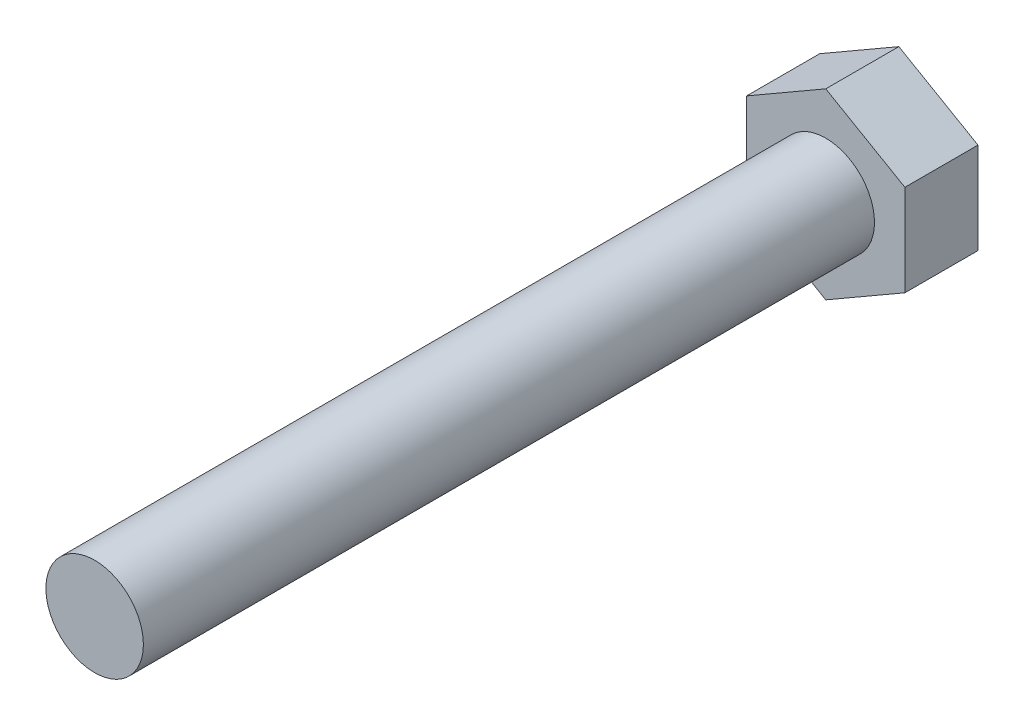
ISO-10303-21;
HEADER;
FILE_DESCRIPTION(('STEP AP214'),'2;1');
FILE_NAME('part.step','',(''),(''),'','','');
FILE_SCHEMA(('AUTOMOTIVE_DESIGN { 1 0 10303 214 1 1 1 1 }'));
ENDSEC;
DATA;
#1=APPLICATION_CONTEXT('core data for automotive mechanical design processes');
#2=APPLICATION_PROTOCOL_DEFINITION('international standard','automotive_design',2000,#1);
#3=PRODUCT_CONTEXT('',#1,'mechanical');
#4=PRODUCT('Part','Part','',(#3));
#5=PRODUCT_RELATED_PRODUCT_CATEGORY('part','',(#4));
#6=PRODUCT_DEFINITION_FORMATION('','',#4);
#7=PRODUCT_DEFINITION_CONTEXT('part definition',#1,'design');
#8=PRODUCT_DEFINITION('design','',#6,#7);
#9=PRODUCT_DEFINITION_SHAPE('','',#8);
#10=(LENGTH_UNIT() NAMED_UNIT(*) SI_UNIT(.MILLI.,.METRE.));
#11=(NAMED_UNIT(*) PLANE_ANGLE_UNIT() SI_UNIT($,.RADIAN.));
#12=(NAMED_UNIT(*) SI_UNIT($,.STERADIAN.) SOLID_ANGLE_UNIT());
#13=UNCERTAINTY_MEASURE_WITH_UNIT(LENGTH_MEASURE(1.E-05),#10,'distance_accuracy_value','');
#14=(GEOMETRIC_REPRESENTATION_CONTEXT(3) GLOBAL_UNCERTAINTY_ASSIGNED_CONTEXT((#13)) GLOBAL_UNIT_ASSIGNED_CONTEXT((#10,
#11,#12)) REPRESENTATION_CONTEXT('',''));
#15=CARTESIAN_POINT('',(0.,0.,0.));
#16=DIRECTION('',(0.,0.,1.));
#17=DIRECTION('',(1.,0.,0.));
#18=AXIS2_PLACEMENT_3D('',#15,#16,#17);
#19=CARTESIAN_POINT('',(6.49519052838323,3.75000000000007,6.));
#20=DIRECTION('',(-0.499999999999995,-0.866025403784441,0.));
#21=DIRECTION('',(0.866025403784442,-0.499999999999995,0.));
#22=AXIS2_PLACEMENT_3D('',#19,#20,#21);
#23=PLANE('',#22);
#24=DIRECTION('',(-0.866025403784442,0.499999999999995,0.));
#25=VECTOR('',#24,1.);
#26=CARTESIAN_POINT('',(6.49519052838323,3.75000000000007,0.));
#27=LINE('',#26,#25);
#28=CARTESIAN_POINT('',(6.49519052838323,3.75000000000007,0.));
#29=VERTEX_POINT('',#28);
#30=CARTESIAN_POINT('',(0.,7.49999999999998,0.));
#31=VERTEX_POINT('',#30);
#32=EDGE_CURVE('E128',#29,#31,#27,.T.);
#33=ORIENTED_EDGE('',*,*,#32,.T.);
#34=DIRECTION('',(0.,0.,-1.));
#35=VECTOR('',#34,1.);
#36=CARTESIAN_POINT('',(0.,7.49999999999998,6.));
#37=LINE('',#36,#35);
#38=CARTESIAN_POINT('',(0.,7.49999999999998,6.));
#39=VERTEX_POINT('',#38);
#40=EDGE_CURVE('E40',#39,#31,#37,.T.);
#41=ORIENTED_EDGE('',*,*,#40,.F.);
#42=DIRECTION('',(-0.866025403784442,0.499999999999995,0.));
#43=VECTOR('',#42,1.);
#44=CARTESIAN_POINT('',(6.49519052838323,3.75000000000007,6.));
#45=LINE('',#44,#43);
#46=CARTESIAN_POINT('',(6.49519052838323,3.75000000000007,6.));
#47=VERTEX_POINT('',#46);
#48=EDGE_CURVE('E145',#47,#39,#45,.T.);
#49=ORIENTED_EDGE('',*,*,#48,.F.);
#50=DIRECTION('',(0.,0.,-1.));
#51=VECTOR('',#50,1.);
#52=CARTESIAN_POINT('',(6.49519052838323,3.75000000000007,6.));
#53=LINE('',#52,#51);
#54=EDGE_CURVE('E124',#47,#29,#53,.T.);
#55=ORIENTED_EDGE('',*,*,#54,.T.);
#56=EDGE_LOOP('',(#33,#41,#49,#55));
#57=FACE_BOUND('',#56,.T.);
#58=ADVANCED_FACE('F37',(#57),#23,.F.);
#59=CARTESIAN_POINT('',(0.,7.49999999999998,6.));
#60=DIRECTION('',(0.500000000000001,-0.866025403784438,0.));
#61=DIRECTION('',(0.866025403784438,0.500000000000001,0.));
#62=AXIS2_PLACEMENT_3D('',#59,#60,#61);
#63=PLANE('',#62);
#64=DIRECTION('',(-0.866025403784438,-0.500000000000001,0.));
#65=VECTOR('',#64,1.);
#66=CARTESIAN_POINT('',(0.,7.49999999999998,0.));
#67=LINE('',#66,#65);
#68=CARTESIAN_POINT('',(-6.49519052838328,3.74999999999998,0.));
#69=VERTEX_POINT('',#68);
#70=EDGE_CURVE('E132',#31,#69,#67,.T.);
#71=ORIENTED_EDGE('',*,*,#70,.T.);
#72=DIRECTION('',(0.,0.,-1.));
#73=VECTOR('',#72,1.);
#74=CARTESIAN_POINT('',(-6.49519052838328,3.74999999999998,6.));
#75=LINE('',#74,#73);
#76=CARTESIAN_POINT('',(-6.49519052838328,3.74999999999998,6.));
#77=VERTEX_POINT('',#76);
#78=EDGE_CURVE('E151',#77,#69,#75,.T.);
#79=ORIENTED_EDGE('',*,*,#78,.F.);
#80=DIRECTION('',(-0.866025403784438,-0.500000000000001,0.));
#81=VECTOR('',#80,1.);
#82=CARTESIAN_POINT('',(0.,7.49999999999998,6.));
#83=LINE('',#82,#81);
#84=EDGE_CURVE('E93',#39,#77,#83,.T.);
#85=ORIENTED_EDGE('',*,*,#84,.F.);
#86=ORIENTED_EDGE('',*,*,#40,.T.);
#87=EDGE_LOOP('',(#71,#79,#85,#86));
#88=FACE_BOUND('',#87,.T.);
#89=ADVANCED_FACE('F158',(#88),#63,.F.);
#90=CARTESIAN_POINT('',(-6.49519052838328,3.74999999999998,6.));
#91=DIRECTION('',(1.,0.,0.));
#92=DIRECTION('',(0.,1.,0.));
#93=AXIS2_PLACEMENT_3D('',#90,#91,#92);
#94=PLANE('',#93);
#95=DIRECTION('',(0.,-1.,0.));
#96=VECTOR('',#95,1.);
#97=CARTESIAN_POINT('',(-6.49519052838328,3.74999999999998,0.));
#98=LINE('',#97,#96);
#99=CARTESIAN_POINT('',(-6.49519052838326,-3.75000000000002,0.));
#100=VERTEX_POINT('',#99);
#101=EDGE_CURVE('E136',#69,#100,#98,.T.);
#102=ORIENTED_EDGE('',*,*,#101,.T.);
#103=DIRECTION('',(0.,0.,-1.));
#104=VECTOR('',#103,1.);
#105=CARTESIAN_POINT('',(-6.49519052838326,-3.75000000000002,6.));
#106=LINE('',#105,#104);
#107=CARTESIAN_POINT('',(-6.49519052838326,-3.75000000000002,6.));
#108=VERTEX_POINT('',#107);
#109=EDGE_CURVE('E117',#108,#100,#106,.T.);
#110=ORIENTED_EDGE('',*,*,#109,.F.);
#111=DIRECTION('',(0.,-1.,0.));
#112=VECTOR('',#111,1.);
#113=CARTESIAN_POINT('',(-6.49519052838328,3.74999999999998,6.));
#114=LINE('',#113,#112);
#115=EDGE_CURVE('E106',#77,#108,#114,.T.);
#116=ORIENTED_EDGE('',*,*,#115,.F.);
#117=ORIENTED_EDGE('',*,*,#78,.T.);
#118=EDGE_LOOP('',(#102,#110,#116,#117));
#119=FACE_BOUND('',#118,.T.);
#120=ADVANCED_FACE('F164',(#119),#94,.F.);
#121=CARTESIAN_POINT('',(-6.49519052838326,-3.75000000000002,6.));
#122=DIRECTION('',(0.499999999999995,0.866025403784441,0.));
#123=DIRECTION('',(-0.866025403784441,0.499999999999995,0.));
#124=AXIS2_PLACEMENT_3D('',#121,#122,#123);
#125=PLANE('',#124);
#126=DIRECTION('',(0.866025403784441,-0.499999999999995,0.));
#127=VECTOR('',#126,1.);
#128=CARTESIAN_POINT('',(-6.49519052838326,-3.75000000000002,0.));
#129=LINE('',#128,#127);
#130=CARTESIAN_POINT('',(0.,-7.49999999999998,0.));
#131=VERTEX_POINT('',#130);
#132=EDGE_CURVE('E115',#100,#131,#129,.T.);
#133=ORIENTED_EDGE('',*,*,#132,.T.);
#134=DIRECTION('',(0.,0.,-1.));
#135=VECTOR('',#134,1.);
#136=CARTESIAN_POINT('',(0.,-7.49999999999998,6.));
#137=LINE('',#136,#135);
#138=CARTESIAN_POINT('',(0.,-7.49999999999998,6.));
#139=VERTEX_POINT('',#138);
#140=EDGE_CURVE('E112',#139,#131,#137,.T.);
#141=ORIENTED_EDGE('',*,*,#140,.F.);
#142=DIRECTION('',(0.866025403784441,-0.499999999999995,0.));
#143=VECTOR('',#142,1.);
#144=CARTESIAN_POINT('',(-6.49519052838326,-3.75000000000002,6.));
#145=LINE('',#144,#143);
#146=EDGE_CURVE('E100',#108,#139,#145,.T.);
#147=ORIENTED_EDGE('',*,*,#146,.F.);
#148=ORIENTED_EDGE('',*,*,#109,.T.);
#149=EDGE_LOOP('',(#133,#141,#147,#148));
#150=FACE_BOUND('',#149,.T.);
#151=ADVANCED_FACE('F113',(#150),#125,.F.);
#152=CARTESIAN_POINT('',(0.,-7.49999999999998,6.));
#153=DIRECTION('',(-0.500000000000007,0.866025403784434,0.));
#154=DIRECTION('',(-0.866025403784435,-0.500000000000007,0.));
#155=AXIS2_PLACEMENT_3D('',#152,#153,#154);
#156=PLANE('',#155);
#157=DIRECTION('',(0.866025403784435,0.500000000000007,0.));
#158=VECTOR('',#157,1.);
#159=CARTESIAN_POINT('',(0.,-7.49999999999998,0.));
#160=LINE('',#159,#158);
#161=CARTESIAN_POINT('',(6.49519052838331,-3.74999999999993,0.));
#162=VERTEX_POINT('',#161);
#163=EDGE_CURVE('E78',#131,#162,#160,.T.);
#164=ORIENTED_EDGE('',*,*,#163,.T.);
#165=DIRECTION('',(0.,0.,-1.));
#166=VECTOR('',#165,1.);
#167=CARTESIAN_POINT('',(6.49519052838331,-3.74999999999993,6.));
#168=LINE('',#167,#166);
#169=CARTESIAN_POINT('',(6.49519052838331,-3.74999999999993,6.));
#170=VERTEX_POINT('',#169);
#171=EDGE_CURVE('E118',#170,#162,#168,.T.);
#172=ORIENTED_EDGE('',*,*,#171,.F.);
#173=DIRECTION('',(0.866025403784435,0.500000000000007,0.));
#174=VECTOR('',#173,1.);
#175=CARTESIAN_POINT('',(0.,-7.49999999999998,6.));
#176=LINE('',#175,#174);
#177=EDGE_CURVE('E104',#139,#170,#176,.T.);
#178=ORIENTED_EDGE('',*,*,#177,.F.);
#179=ORIENTED_EDGE('',*,*,#140,.T.);
#180=EDGE_LOOP('',(#164,#172,#178,#179));
#181=FACE_BOUND('',#180,.T.);
#182=ADVANCED_FACE('F120',(#181),#156,.F.);
#183=CARTESIAN_POINT('',(6.49519052838331,-3.74999999999993,6.));
#184=DIRECTION('',(-1.,0.,0.));
#185=DIRECTION('',(0.,-1.,0.));
#186=AXIS2_PLACEMENT_3D('',#183,#184,#185);
#187=PLANE('',#186);
#188=DIRECTION('',(0.,1.,0.));
#189=VECTOR('',#188,1.);
#190=CARTESIAN_POINT('',(6.49519052838331,-3.74999999999993,0.));
#191=LINE('',#190,#189);
#192=EDGE_CURVE('E84',#162,#29,#191,.T.);
#193=ORIENTED_EDGE('',*,*,#192,.T.);
#194=ORIENTED_EDGE('',*,*,#54,.F.);
#195=DIRECTION('',(0.,1.,0.));
#196=VECTOR('',#195,1.);
#197=CARTESIAN_POINT('',(6.49519052838331,-3.74999999999993,6.));
#198=LINE('',#197,#196);
#199=EDGE_CURVE('E55',#170,#47,#198,.T.);
#200=ORIENTED_EDGE('',*,*,#199,.F.);
#201=ORIENTED_EDGE('',*,*,#171,.T.);
#202=EDGE_LOOP('',(#193,#194,#200,#201));
#203=FACE_BOUND('',#202,.T.);
#204=ADVANCED_FACE('F184',(#203),#187,.F.);
#205=CARTESIAN_POINT('',(0.,0.,6.));
#206=DIRECTION('',(0.,0.,1.));
#207=DIRECTION('',(1.,0.,0.));
#208=AXIS2_PLACEMENT_3D('',#205,#206,#207);
#209=PLANE('',#208);
#210=CARTESIAN_POINT('',(0.,0.,6.));
#211=DIRECTION('',(0.,0.,1.));
#212=DIRECTION('',(1.,0.,0.));
#213=AXIS2_PLACEMENT_3D('',#210,#211,#212);
#214=CIRCLE('',#213,4.);
#215=CARTESIAN_POINT('',(4.,0.,6.));
#216=VERTEX_POINT('',#215);
#217=EDGE_CURVE('E11',#216,#216,#214,.T.);
#218=ORIENTED_EDGE('',*,*,#217,.F.);
#219=EDGE_LOOP('',(#218));
#220=FACE_BOUND('',#219,.T.);
#221=ORIENTED_EDGE('',*,*,#48,.T.);
#222=ORIENTED_EDGE('',*,*,#84,.T.);
#223=ORIENTED_EDGE('',*,*,#115,.T.);
#224=ORIENTED_EDGE('',*,*,#146,.T.);
#225=ORIENTED_EDGE('',*,*,#177,.T.);
#226=ORIENTED_EDGE('',*,*,#199,.T.);
#227=EDGE_LOOP('',(#221,#222,#223,#224,#225,#226));
#228=FACE_BOUND('',#227,.T.);
#229=ADVANCED_FACE('F102',(#220,#228),#209,.T.);
#230=CARTESIAN_POINT('',(0.,0.,0.));
#231=DIRECTION('',(0.,0.,1.));
#232=DIRECTION('',(1.,0.,0.));
#233=AXIS2_PLACEMENT_3D('',#230,#231,#232);
#234=PLANE('',#233);
#235=ORIENTED_EDGE('',*,*,#32,.F.);
#236=ORIENTED_EDGE('',*,*,#192,.F.);
#237=ORIENTED_EDGE('',*,*,#163,.F.);
#238=ORIENTED_EDGE('',*,*,#132,.F.);
#239=ORIENTED_EDGE('',*,*,#101,.F.);
#240=ORIENTED_EDGE('',*,*,#70,.F.);
#241=EDGE_LOOP('',(#235,#236,#237,#238,#239,#240));
#242=FACE_BOUND('',#241,.T.);
#243=ADVANCED_FACE('F163',(#242),#234,.F.);
#244=CARTESIAN_POINT('',(0.,0.,66.));
#245=DIRECTION('',(0.,0.,-1.));
#246=DIRECTION('',(-1.,0.,0.));
#247=AXIS2_PLACEMENT_3D('',#244,#245,#246);
#248=CYLINDRICAL_SURFACE('',#247,4.);
#249=CARTESIAN_POINT('',(0.,0.,66.));
#250=DIRECTION('',(0.,0.,1.));
#251=DIRECTION('',(1.,0.,0.));
#252=AXIS2_PLACEMENT_3D('',#249,#250,#251);
#253=CIRCLE('',#252,4.);
#254=CARTESIAN_POINT('',(4.,0.,66.));
#255=VERTEX_POINT('',#254);
#256=EDGE_CURVE('E133',#255,#255,#253,.T.);
#257=ORIENTED_EDGE('',*,*,#256,.F.);
#258=EDGE_LOOP('',(#257));
#259=FACE_BOUND('',#258,.T.);
#260=ORIENTED_EDGE('',*,*,#217,.T.);
#261=EDGE_LOOP('',(#260));
#262=FACE_BOUND('',#261,.T.);
#263=ADVANCED_FACE('F177',(#259,#262),#248,.T.);
#264=CARTESIAN_POINT('',(0.,0.,66.));
#265=DIRECTION('',(0.,0.,1.));
#266=DIRECTION('',(1.,0.,0.));
#267=AXIS2_PLACEMENT_3D('',#264,#265,#266);
#268=PLANE('',#267);
#269=ORIENTED_EDGE('',*,*,#256,.T.);
#270=EDGE_LOOP('',(#269));
#271=FACE_BOUND('',#270,.T.);
#272=ADVANCED_FACE('F175',(#271),#268,.T.);
#273=CLOSED_SHELL('',(#58,#89,#120,#151,#182,#204,#229,#243,#263,#272));
#274=MANIFOLD_SOLID_BREP('B2',#273);
#275=ADVANCED_BREP_SHAPE_REPRESENTATION('',(#18,#274),#14);
#276=SHAPE_DEFINITION_REPRESENTATION(#9,#275);
ENDSEC;
END-ISO-10303-21;
